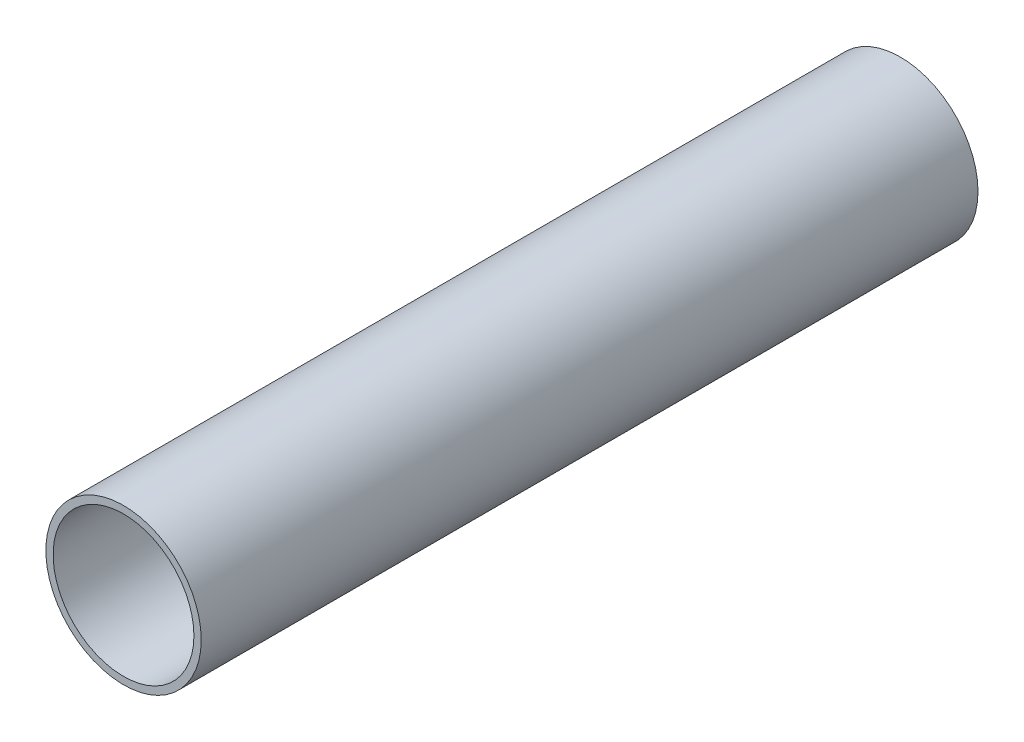
ISO-10303-21;
HEADER;
FILE_DESCRIPTION(('STEP AP214'),'2;1');
FILE_NAME('part.step','',(''),(''),'','','');
FILE_SCHEMA(('AUTOMOTIVE_DESIGN { 1 0 10303 214 1 1 1 1 }'));
ENDSEC;
DATA;
#1=APPLICATION_CONTEXT('core data for automotive mechanical design processes');
#2=APPLICATION_PROTOCOL_DEFINITION('international standard','automotive_design',2000,#1);
#3=PRODUCT_CONTEXT('',#1,'mechanical');
#4=PRODUCT('Part','Part','',(#3));
#5=PRODUCT_RELATED_PRODUCT_CATEGORY('part','',(#4));
#6=PRODUCT_DEFINITION_FORMATION('','',#4);
#7=PRODUCT_DEFINITION_CONTEXT('part definition',#1,'design');
#8=PRODUCT_DEFINITION('design','',#6,#7);
#9=PRODUCT_DEFINITION_SHAPE('','',#8);
#10=(LENGTH_UNIT() NAMED_UNIT(*) SI_UNIT(.MILLI.,.METRE.));
#11=(NAMED_UNIT(*) PLANE_ANGLE_UNIT() SI_UNIT($,.RADIAN.));
#12=(NAMED_UNIT(*) SI_UNIT($,.STERADIAN.) SOLID_ANGLE_UNIT());
#13=UNCERTAINTY_MEASURE_WITH_UNIT(LENGTH_MEASURE(1.E-05),#10,'distance_accuracy_value','');
#14=(GEOMETRIC_REPRESENTATION_CONTEXT(3) GLOBAL_UNCERTAINTY_ASSIGNED_CONTEXT((#13)) GLOBAL_UNIT_ASSIGNED_CONTEXT((#10,
#11,#12)) REPRESENTATION_CONTEXT('',''));
#15=CARTESIAN_POINT('',(0.,0.,0.));
#16=DIRECTION('',(0.,0.,1.));
#17=DIRECTION('',(1.,0.,0.));
#18=AXIS2_PLACEMENT_3D('',#15,#16,#17);
#19=CARTESIAN_POINT('',(0.,0.,-80.));
#20=DIRECTION('',(0.,0.,1.));
#21=DIRECTION('',(1.,0.,0.));
#22=AXIS2_PLACEMENT_3D('',#19,#20,#21);
#23=CYLINDRICAL_SURFACE('',#22,8.);
#24=CARTESIAN_POINT('',(0.,0.,-80.));
#25=DIRECTION('',(0.,0.,1.));
#26=DIRECTION('',(1.,0.,0.));
#27=AXIS2_PLACEMENT_3D('',#24,#25,#26);
#28=CIRCLE('',#27,8.);
#29=CARTESIAN_POINT('',(8.,0.,-80.));
#30=VERTEX_POINT('',#29);
#31=EDGE_CURVE('E10',#30,#30,#28,.T.);
#32=ORIENTED_EDGE('',*,*,#31,.T.);
#33=EDGE_LOOP('',(#32));
#34=FACE_BOUND('',#33,.T.);
#35=CARTESIAN_POINT('',(0.,0.,0.));
#36=DIRECTION('',(0.,0.,1.));
#37=DIRECTION('',(1.,0.,0.));
#38=AXIS2_PLACEMENT_3D('',#35,#36,#37);
#39=CIRCLE('',#38,8.);
#40=CARTESIAN_POINT('',(8.,0.,0.));
#41=VERTEX_POINT('',#40);
#42=EDGE_CURVE('E31',#41,#41,#39,.T.);
#43=ORIENTED_EDGE('',*,*,#42,.F.);
#44=EDGE_LOOP('',(#43));
#45=FACE_BOUND('',#44,.T.);
#46=ADVANCED_FACE('F28',(#34,#45),#23,.T.);
#47=CARTESIAN_POINT('',(0.,0.,-80.));
#48=DIRECTION('',(0.,0.,1.));
#49=DIRECTION('',(1.,0.,0.));
#50=AXIS2_PLACEMENT_3D('',#47,#48,#49);
#51=PLANE('',#50);
#52=CARTESIAN_POINT('',(0.,0.,-80.));
#53=DIRECTION('',(0.,0.,1.));
#54=DIRECTION('',(1.,0.,0.));
#55=AXIS2_PLACEMENT_3D('',#52,#53,#54);
#56=CIRCLE('',#55,7.25);
#57=CARTESIAN_POINT('',(7.25,0.,-80.));
#58=VERTEX_POINT('',#57);
#59=EDGE_CURVE('E38',#58,#58,#56,.T.);
#60=ORIENTED_EDGE('',*,*,#59,.T.);
#61=EDGE_LOOP('',(#60));
#62=FACE_BOUND('',#61,.T.);
#63=ORIENTED_EDGE('',*,*,#31,.F.);
#64=EDGE_LOOP('',(#63));
#65=FACE_BOUND('',#64,.T.);
#66=ADVANCED_FACE('F46',(#62,#65),#51,.F.);
#67=CARTESIAN_POINT('',(0.,0.,0.));
#68=DIRECTION('',(0.,0.,1.));
#69=DIRECTION('',(1.,0.,0.));
#70=AXIS2_PLACEMENT_3D('',#67,#68,#69);
#71=PLANE('',#70);
#72=CARTESIAN_POINT('',(0.,0.,0.));
#73=DIRECTION('',(0.,0.,1.));
#74=DIRECTION('',(1.,0.,0.));
#75=AXIS2_PLACEMENT_3D('',#72,#73,#74);
#76=CIRCLE('',#75,7.25);
#77=CARTESIAN_POINT('',(7.25,0.,0.));
#78=VERTEX_POINT('',#77);
#79=EDGE_CURVE('E40',#78,#78,#76,.T.);
#80=ORIENTED_EDGE('',*,*,#79,.F.);
#81=EDGE_LOOP('',(#80));
#82=FACE_BOUND('',#81,.T.);
#83=ORIENTED_EDGE('',*,*,#42,.T.);
#84=EDGE_LOOP('',(#83));
#85=FACE_BOUND('',#84,.T.);
#86=ADVANCED_FACE('F52',(#82,#85),#71,.T.);
#87=CARTESIAN_POINT('',(0.,0.,-80.));
#88=DIRECTION('',(0.,0.,1.));
#89=DIRECTION('',(1.,0.,0.));
#90=AXIS2_PLACEMENT_3D('',#87,#88,#89);
#91=CYLINDRICAL_SURFACE('',#90,7.25);
#92=ORIENTED_EDGE('',*,*,#59,.F.);
#93=EDGE_LOOP('',(#92));
#94=FACE_BOUND('',#93,.T.);
#95=ORIENTED_EDGE('',*,*,#79,.T.);
#96=EDGE_LOOP('',(#95));
#97=FACE_BOUND('',#96,.T.);
#98=ADVANCED_FACE('F49',(#94,#97),#91,.F.);
#99=CLOSED_SHELL('',(#46,#66,#86,#98));
#100=MANIFOLD_SOLID_BREP('B2',#99);
#101=ADVANCED_BREP_SHAPE_REPRESENTATION('',(#18,#100),#14);
#102=SHAPE_DEFINITION_REPRESENTATION(#9,#101);
ENDSEC;
END-ISO-10303-21;
